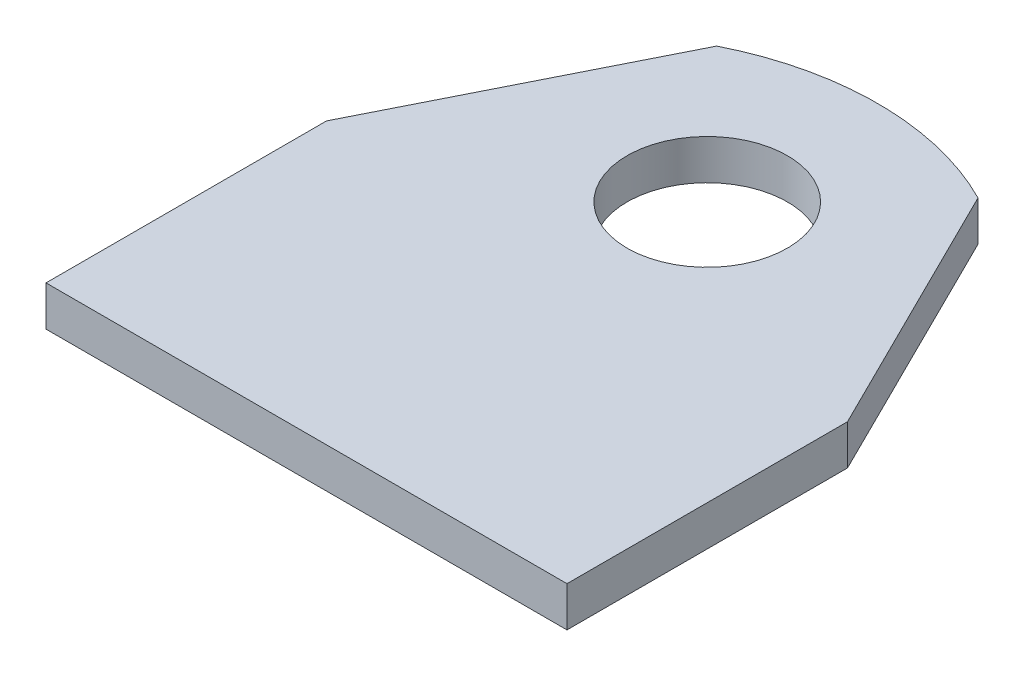
ISO-10303-21;
HEADER;
FILE_DESCRIPTION(('STEP AP214'),'2;1');
FILE_NAME('part.step','',(''),(''),'','','');
FILE_SCHEMA(('AUTOMOTIVE_DESIGN { 1 0 10303 214 1 1 1 1 }'));
ENDSEC;
DATA;
#1=APPLICATION_CONTEXT('core data for automotive mechanical design processes');
#2=APPLICATION_PROTOCOL_DEFINITION('international standard','automotive_design',2000,#1);
#3=PRODUCT_CONTEXT('',#1,'mechanical');
#4=PRODUCT('Part','Part','',(#3));
#5=PRODUCT_RELATED_PRODUCT_CATEGORY('part','',(#4));
#6=PRODUCT_DEFINITION_FORMATION('','',#4);
#7=PRODUCT_DEFINITION_CONTEXT('part definition',#1,'design');
#8=PRODUCT_DEFINITION('design','',#6,#7);
#9=PRODUCT_DEFINITION_SHAPE('','',#8);
#10=(LENGTH_UNIT() NAMED_UNIT(*) SI_UNIT(.MILLI.,.METRE.));
#11=(NAMED_UNIT(*) PLANE_ANGLE_UNIT() SI_UNIT($,.RADIAN.));
#12=(NAMED_UNIT(*) SI_UNIT($,.STERADIAN.) SOLID_ANGLE_UNIT());
#13=UNCERTAINTY_MEASURE_WITH_UNIT(LENGTH_MEASURE(1.E-05),#10,'distance_accuracy_value','');
#14=(GEOMETRIC_REPRESENTATION_CONTEXT(3) GLOBAL_UNCERTAINTY_ASSIGNED_CONTEXT((#13)) GLOBAL_UNIT_ASSIGNED_CONTEXT((#10,
#11,#12)) REPRESENTATION_CONTEXT('',''));
#15=CARTESIAN_POINT('',(0.,0.,0.));
#16=DIRECTION('',(0.,0.,1.));
#17=DIRECTION('',(1.,0.,0.));
#18=AXIS2_PLACEMENT_3D('',#15,#16,#17);
#19=CARTESIAN_POINT('',(-14.0201140300382,5.,-7.02687235899768));
#20=DIRECTION('',(-0.893997884960782,0.,-0.448071179262456));
#21=DIRECTION('',(-0.448071179262456,0.,0.893997884960782));
#22=AXIS2_PLACEMENT_3D('',#19,#20,#21);
#23=PLANE('',#22);
#24=DIRECTION('',(0.448071179262456,0.,-0.893997884960782));
#25=VECTOR('',#24,1.);
#26=CARTESIAN_POINT('',(-14.0201140300382,0.,-7.02687235899768));
#27=LINE('',#26,#25);
#28=CARTESIAN_POINT('',(0.,0.,-35.));
#29=VERTEX_POINT('',#28);
#30=CARTESIAN_POINT('',(16.2524378142078,0.,-67.4270912832975));
#31=VERTEX_POINT('',#30);
#32=EDGE_CURVE('E135',#29,#31,#27,.T.);
#33=ORIENTED_EDGE('',*,*,#32,.F.);
#34=DIRECTION('',(0.,-1.,0.));
#35=VECTOR('',#34,1.);
#36=CARTESIAN_POINT('',(0.,5.,-35.));
#37=LINE('',#36,#35);
#38=CARTESIAN_POINT('',(0.,5.,-35.));
#39=VERTEX_POINT('',#38);
#40=EDGE_CURVE('E11',#39,#29,#37,.T.);
#41=ORIENTED_EDGE('',*,*,#40,.F.);
#42=DIRECTION('',(0.448071179262456,0.,-0.893997884960782));
#43=VECTOR('',#42,1.);
#44=CARTESIAN_POINT('',(-14.0201140300382,5.,-7.02687235899768));
#45=LINE('',#44,#43);
#46=CARTESIAN_POINT('',(16.2524378142078,5.,-67.4270912832975));
#47=VERTEX_POINT('',#46);
#48=EDGE_CURVE('E179',#39,#47,#45,.T.);
#49=ORIENTED_EDGE('',*,*,#48,.T.);
#50=DIRECTION('',(0.,-1.,0.));
#51=VECTOR('',#50,1.);
#52=CARTESIAN_POINT('',(16.2524378142078,5.,-67.4270912832975));
#53=LINE('',#52,#51);
#54=EDGE_CURVE('E56',#47,#31,#53,.T.);
#55=ORIENTED_EDGE('',*,*,#54,.T.);
#56=EDGE_LOOP('',(#33,#41,#49,#55));
#57=FACE_BOUND('',#56,.T.);
#58=ADVANCED_FACE('F39',(#57),#23,.T.);
#59=CARTESIAN_POINT('',(0.,5.,0.));
#60=DIRECTION('',(-1.,0.,0.));
#61=DIRECTION('',(0.,0.,1.));
#62=AXIS2_PLACEMENT_3D('',#59,#60,#61);
#63=PLANE('',#62);
#64=DIRECTION('',(0.,0.,-1.));
#65=VECTOR('',#64,1.);
#66=CARTESIAN_POINT('',(0.,0.,0.));
#67=LINE('',#66,#65);
#68=CARTESIAN_POINT('',(0.,0.,0.));
#69=VERTEX_POINT('',#68);
#70=EDGE_CURVE('E132',#69,#29,#67,.T.);
#71=ORIENTED_EDGE('',*,*,#70,.F.);
#72=DIRECTION('',(0.,-1.,0.));
#73=VECTOR('',#72,1.);
#74=CARTESIAN_POINT('',(0.,5.,0.));
#75=LINE('',#74,#73);
#76=CARTESIAN_POINT('',(0.,5.,0.));
#77=VERTEX_POINT('',#76);
#78=EDGE_CURVE('E48',#77,#69,#75,.T.);
#79=ORIENTED_EDGE('',*,*,#78,.F.);
#80=DIRECTION('',(0.,0.,-1.));
#81=VECTOR('',#80,1.);
#82=CARTESIAN_POINT('',(0.,5.,0.));
#83=LINE('',#82,#81);
#84=EDGE_CURVE('E181',#77,#39,#83,.T.);
#85=ORIENTED_EDGE('',*,*,#84,.T.);
#86=ORIENTED_EDGE('',*,*,#40,.T.);
#87=EDGE_LOOP('',(#71,#79,#85,#86));
#88=FACE_BOUND('',#87,.T.);
#89=ADVANCED_FACE('F134',(#88),#63,.T.);
#90=CARTESIAN_POINT('',(0.,5.,0.));
#91=DIRECTION('',(0.,0.,-1.));
#92=DIRECTION('',(-1.,0.,0.));
#93=AXIS2_PLACEMENT_3D('',#90,#91,#92);
#94=PLANE('',#93);
#95=DIRECTION('',(1.,0.,0.));
#96=VECTOR('',#95,1.);
#97=CARTESIAN_POINT('',(0.,0.,0.));
#98=LINE('',#97,#96);
#99=CARTESIAN_POINT('',(65.,0.,0.));
#100=VERTEX_POINT('',#99);
#101=EDGE_CURVE('E125',#69,#100,#98,.T.);
#102=ORIENTED_EDGE('',*,*,#101,.T.);
#103=DIRECTION('',(0.,-1.,0.));
#104=VECTOR('',#103,1.);
#105=CARTESIAN_POINT('',(65.,5.,0.));
#106=LINE('',#105,#104);
#107=CARTESIAN_POINT('',(65.,5.,0.));
#108=VERTEX_POINT('',#107);
#109=EDGE_CURVE('E116',#108,#100,#106,.T.);
#110=ORIENTED_EDGE('',*,*,#109,.F.);
#111=DIRECTION('',(1.,0.,0.));
#112=VECTOR('',#111,1.);
#113=CARTESIAN_POINT('',(0.,5.,0.));
#114=LINE('',#113,#112);
#115=EDGE_CURVE('E109',#77,#108,#114,.T.);
#116=ORIENTED_EDGE('',*,*,#115,.F.);
#117=ORIENTED_EDGE('',*,*,#78,.T.);
#118=EDGE_LOOP('',(#102,#110,#116,#117));
#119=FACE_BOUND('',#118,.T.);
#120=ADVANCED_FACE('F124',(#119),#94,.F.);
#121=CARTESIAN_POINT('',(65.,5.,0.));
#122=DIRECTION('',(-1.,0.,0.));
#123=DIRECTION('',(0.,0.,1.));
#124=AXIS2_PLACEMENT_3D('',#121,#122,#123);
#125=PLANE('',#124);
#126=DIRECTION('',(0.,0.,-1.));
#127=VECTOR('',#126,1.);
#128=CARTESIAN_POINT('',(65.,0.,0.));
#129=LINE('',#128,#127);
#130=CARTESIAN_POINT('',(65.,0.,-35.));
#131=VERTEX_POINT('',#130);
#132=EDGE_CURVE('E115',#100,#131,#129,.T.);
#133=ORIENTED_EDGE('',*,*,#132,.T.);
#134=DIRECTION('',(0.,-1.,0.));
#135=VECTOR('',#134,1.);
#136=CARTESIAN_POINT('',(65.,5.,-35.));
#137=LINE('',#136,#135);
#138=CARTESIAN_POINT('',(65.,5.,-35.));
#139=VERTEX_POINT('',#138);
#140=EDGE_CURVE('E98',#139,#131,#137,.T.);
#141=ORIENTED_EDGE('',*,*,#140,.F.);
#142=DIRECTION('',(0.,0.,-1.));
#143=VECTOR('',#142,1.);
#144=CARTESIAN_POINT('',(65.,5.,0.));
#145=LINE('',#144,#143);
#146=EDGE_CURVE('E103',#108,#139,#145,.T.);
#147=ORIENTED_EDGE('',*,*,#146,.F.);
#148=ORIENTED_EDGE('',*,*,#109,.T.);
#149=EDGE_LOOP('',(#133,#141,#147,#148));
#150=FACE_BOUND('',#149,.T.);
#151=ADVANCED_FACE('F114',(#150),#125,.F.);
#152=CARTESIAN_POINT('',(66.0915106187497,5.,-32.8006671210908));
#153=DIRECTION('',(-0.895751935780854,0.,0.444554236899001));
#154=DIRECTION('',(0.444554236899001,0.,0.895751935780854));
#155=AXIS2_PLACEMENT_3D('',#152,#153,#154);
#156=PLANE('',#155);
#157=DIRECTION('',(-0.444554236899001,0.,-0.895751935780854));
#158=VECTOR('',#157,1.);
#159=CARTESIAN_POINT('',(66.0915106187497,0.,-32.8006671210908));
#160=LINE('',#159,#158);
#161=CARTESIAN_POINT('',(48.9599516789731,0.,-67.3198006924914));
#162=VERTEX_POINT('',#161);
#163=EDGE_CURVE('E142',#131,#162,#160,.T.);
#164=ORIENTED_EDGE('',*,*,#163,.T.);
#165=DIRECTION('',(0.,-1.,0.));
#166=VECTOR('',#165,1.);
#167=CARTESIAN_POINT('',(48.9599516789731,5.,-67.3198006924914));
#168=LINE('',#167,#166);
#169=CARTESIAN_POINT('',(48.9599516789731,5.,-67.3198006924914));
#170=VERTEX_POINT('',#169);
#171=EDGE_CURVE('E76',#170,#162,#168,.T.);
#172=ORIENTED_EDGE('',*,*,#171,.F.);
#173=DIRECTION('',(-0.444554236899001,0.,-0.895751935780854));
#174=VECTOR('',#173,1.);
#175=CARTESIAN_POINT('',(66.0915106187497,5.,-32.8006671210908));
#176=LINE('',#175,#174);
#177=EDGE_CURVE('E94',#139,#170,#176,.T.);
#178=ORIENTED_EDGE('',*,*,#177,.F.);
#179=ORIENTED_EDGE('',*,*,#140,.T.);
#180=EDGE_LOOP('',(#164,#172,#178,#179));
#181=FACE_BOUND('',#180,.T.);
#182=ADVANCED_FACE('F96',(#181),#156,.F.);
#183=CARTESIAN_POINT('',(32.5,5.,-50.));
#184=DIRECTION('',(0.,-1.,0.));
#185=DIRECTION('',(0.,0.,-1.));
#186=AXIS2_PLACEMENT_3D('',#183,#184,#185);
#187=CYLINDRICAL_SURFACE('',#186,10.);
#188=CARTESIAN_POINT('',(32.5,5.,-50.));
#189=DIRECTION('',(0.,1.,0.));
#190=DIRECTION('',(0.,0.,1.));
#191=AXIS2_PLACEMENT_3D('',#188,#189,#190);
#192=CIRCLE('',#191,10.);
#193=CARTESIAN_POINT('',(32.5,5.,-40.));
#194=VERTEX_POINT('',#193);
#195=EDGE_CURVE('E146',#194,#194,#192,.T.);
#196=ORIENTED_EDGE('',*,*,#195,.T.);
#197=EDGE_LOOP('',(#196));
#198=FACE_BOUND('',#197,.T.);
#199=CARTESIAN_POINT('',(32.5,0.,-50.));
#200=DIRECTION('',(0.,1.,0.));
#201=DIRECTION('',(0.,0.,1.));
#202=AXIS2_PLACEMENT_3D('',#199,#200,#201);
#203=CIRCLE('',#202,10.);
#204=CARTESIAN_POINT('',(32.5,0.,-40.));
#205=VERTEX_POINT('',#204);
#206=EDGE_CURVE('E137',#205,#205,#203,.T.);
#207=ORIENTED_EDGE('',*,*,#206,.F.);
#208=EDGE_LOOP('',(#207));
#209=FACE_BOUND('',#208,.T.);
#210=ADVANCED_FACE('F41',(#198,#209),#187,.F.);
#211=CARTESIAN_POINT('',(32.5,5.,-35.));
#212=DIRECTION('',(0.,-1.,0.));
#213=DIRECTION('',(0.,0.,-1.));
#214=AXIS2_PLACEMENT_3D('',#211,#212,#213);
#215=CYLINDRICAL_SURFACE('',#214,36.2698156333403);
#216=CARTESIAN_POINT('',(32.5,0.,-35.));
#217=DIRECTION('',(0.,1.,0.));
#218=DIRECTION('',(0.,0.,1.));
#219=AXIS2_PLACEMENT_3D('',#216,#217,#218);
#220=CIRCLE('',#219,36.2698156333403);
#221=EDGE_CURVE('E144',#31,#162,#220,.F.);
#222=ORIENTED_EDGE('',*,*,#221,.F.);
#223=ORIENTED_EDGE('',*,*,#54,.F.);
#224=CARTESIAN_POINT('',(32.5,5.,-35.));
#225=DIRECTION('',(0.,1.,0.));
#226=DIRECTION('',(0.,0.,1.));
#227=AXIS2_PLACEMENT_3D('',#224,#225,#226);
#228=CIRCLE('',#227,36.2698156333403);
#229=EDGE_CURVE('E102',#47,#170,#228,.F.);
#230=ORIENTED_EDGE('',*,*,#229,.T.);
#231=ORIENTED_EDGE('',*,*,#171,.T.);
#232=EDGE_LOOP('',(#222,#223,#230,#231));
#233=FACE_BOUND('',#232,.T.);
#234=ADVANCED_FACE('F153',(#233),#215,.T.);
#235=CARTESIAN_POINT('',(0.,5.,0.));
#236=DIRECTION('',(0.,1.,0.));
#237=DIRECTION('',(0.,0.,1.));
#238=AXIS2_PLACEMENT_3D('',#235,#236,#237);
#239=PLANE('',#238);
#240=ORIENTED_EDGE('',*,*,#195,.F.);
#241=EDGE_LOOP('',(#240));
#242=FACE_BOUND('',#241,.T.);
#243=ORIENTED_EDGE('',*,*,#48,.F.);
#244=ORIENTED_EDGE('',*,*,#84,.F.);
#245=ORIENTED_EDGE('',*,*,#115,.T.);
#246=ORIENTED_EDGE('',*,*,#146,.T.);
#247=ORIENTED_EDGE('',*,*,#177,.T.);
#248=ORIENTED_EDGE('',*,*,#229,.F.);
#249=EDGE_LOOP('',(#243,#244,#245,#246,#247,#248));
#250=FACE_BOUND('',#249,.T.);
#251=ADVANCED_FACE('F106',(#242,#250),#239,.T.);
#252=CARTESIAN_POINT('',(0.,0.,0.));
#253=DIRECTION('',(0.,1.,0.));
#254=DIRECTION('',(0.,0.,1.));
#255=AXIS2_PLACEMENT_3D('',#252,#253,#254);
#256=PLANE('',#255);
#257=ORIENTED_EDGE('',*,*,#206,.T.);
#258=EDGE_LOOP('',(#257));
#259=FACE_BOUND('',#258,.T.);
#260=ORIENTED_EDGE('',*,*,#32,.T.);
#261=ORIENTED_EDGE('',*,*,#221,.T.);
#262=ORIENTED_EDGE('',*,*,#163,.F.);
#263=ORIENTED_EDGE('',*,*,#132,.F.);
#264=ORIENTED_EDGE('',*,*,#101,.F.);
#265=ORIENTED_EDGE('',*,*,#70,.T.);
#266=EDGE_LOOP('',(#260,#261,#262,#263,#264,#265));
#267=FACE_BOUND('',#266,.T.);
#268=ADVANCED_FACE('F131',(#259,#267),#256,.F.);
#269=CLOSED_SHELL('',(#58,#89,#120,#151,#182,#210,#234,#251,#268));
#270=MANIFOLD_SOLID_BREP('B2',#269);
#271=ADVANCED_BREP_SHAPE_REPRESENTATION('',(#18,#270),#14);
#272=SHAPE_DEFINITION_REPRESENTATION(#9,#271);
ENDSEC;
END-ISO-10303-21;
